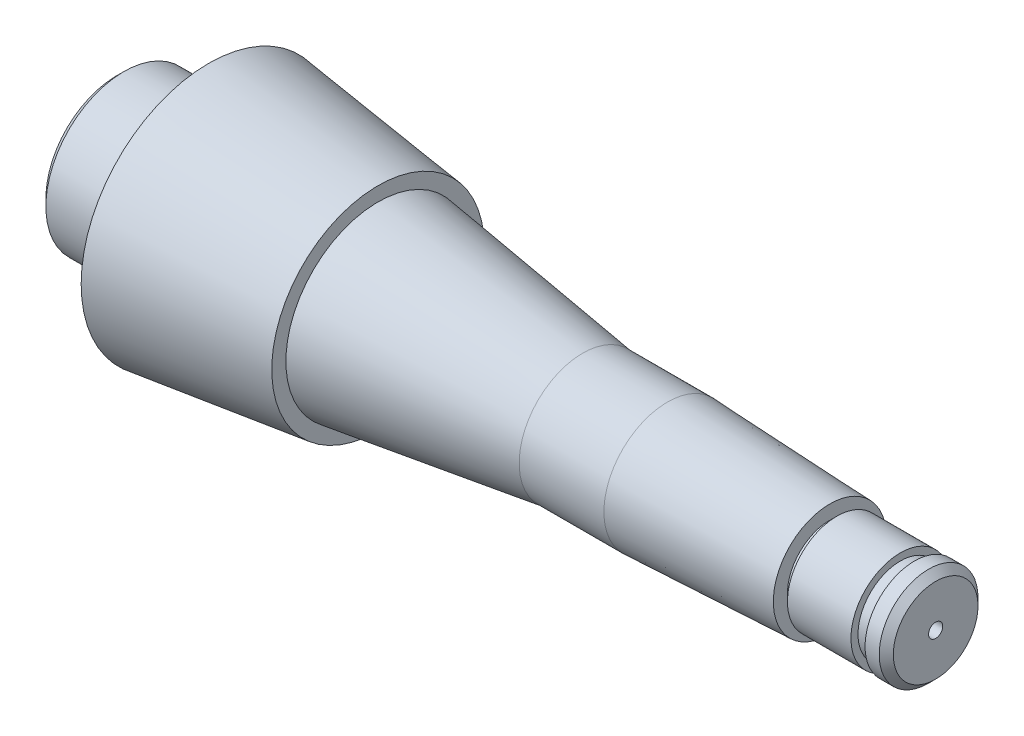
ISO-10303-21;
HEADER;
FILE_DESCRIPTION(('STEP AP214'),'2;1');
FILE_NAME('part.step','',(''),(''),'','','');
FILE_SCHEMA(('AUTOMOTIVE_DESIGN { 1 0 10303 214 1 1 1 1 }'));
ENDSEC;
DATA;
#1=APPLICATION_CONTEXT('core data for automotive mechanical design processes');
#2=APPLICATION_PROTOCOL_DEFINITION('international standard','automotive_design',2000,#1);
#3=PRODUCT_CONTEXT('',#1,'mechanical');
#4=PRODUCT('Part','Part','',(#3));
#5=PRODUCT_RELATED_PRODUCT_CATEGORY('part','',(#4));
#6=PRODUCT_DEFINITION_FORMATION('','',#4);
#7=PRODUCT_DEFINITION_CONTEXT('part definition',#1,'design');
#8=PRODUCT_DEFINITION('design','',#6,#7);
#9=PRODUCT_DEFINITION_SHAPE('','',#8);
#10=(LENGTH_UNIT() NAMED_UNIT(*) SI_UNIT(.MILLI.,.METRE.));
#11=(NAMED_UNIT(*) PLANE_ANGLE_UNIT() SI_UNIT($,.RADIAN.));
#12=(NAMED_UNIT(*) SI_UNIT($,.STERADIAN.) SOLID_ANGLE_UNIT());
#13=UNCERTAINTY_MEASURE_WITH_UNIT(LENGTH_MEASURE(1.E-05),#10,'distance_accuracy_value','');
#14=(GEOMETRIC_REPRESENTATION_CONTEXT(3) GLOBAL_UNCERTAINTY_ASSIGNED_CONTEXT((#13)) GLOBAL_UNIT_ASSIGNED_CONTEXT((#10,
#11,#12)) REPRESENTATION_CONTEXT('',''));
#15=CARTESIAN_POINT('',(0.,0.,0.));
#16=DIRECTION('',(0.,0.,1.));
#17=DIRECTION('',(1.,0.,0.));
#18=AXIS2_PLACEMENT_3D('',#15,#16,#17);
#19=CARTESIAN_POINT('',(65.,0.,0.));
#20=DIRECTION('',(-1.,0.,0.));
#21=DIRECTION('',(0.,0.,1.));
#22=AXIS2_PLACEMENT_3D('',#19,#20,#21);
#23=CONICAL_SURFACE('',#22,1.,0.463647609000803);
#24=CARTESIAN_POINT('',(66.,0.,0.));
#25=DIRECTION('',(1.,0.,0.));
#26=DIRECTION('',(0.,0.,-1.));
#27=AXIS2_PLACEMENT_3D('',#24,#25,#26);
#28=CIRCLE('',#27,0.500000000000006);
#29=CARTESIAN_POINT('',(66.,0.,-0.500000000000006));
#30=VERTEX_POINT('',#29);
#31=EDGE_CURVE('E12',#30,#30,#28,.T.);
#32=ORIENTED_EDGE('',*,*,#31,.T.);
#33=EDGE_LOOP('',(#32));
#34=FACE_BOUND('',#33,.T.);
#35=CARTESIAN_POINT('',(65.,0.,0.));
#36=DIRECTION('',(1.,0.,0.));
#37=DIRECTION('',(0.,0.,-1.));
#38=AXIS2_PLACEMENT_3D('',#35,#36,#37);
#39=CIRCLE('',#38,1.);
#40=CARTESIAN_POINT('',(65.,0.,-1.));
#41=VERTEX_POINT('',#40);
#42=EDGE_CURVE('E130',#41,#41,#39,.T.);
#43=ORIENTED_EDGE('',*,*,#42,.F.);
#44=EDGE_LOOP('',(#43));
#45=FACE_BOUND('',#44,.T.);
#46=ADVANCED_FACE('F39',(#34,#45),#23,.F.);
#47=CARTESIAN_POINT('',(15.9891729683934,0.,0.));
#48=DIRECTION('',(1.,0.,0.));
#49=DIRECTION('',(0.,0.,-1.));
#50=AXIS2_PLACEMENT_3D('',#47,#48,#49);
#51=CYLINDRICAL_SURFACE('',#50,0.500000000000007);
#52=CARTESIAN_POINT('',(78.5,0.,0.));
#53=DIRECTION('',(1.,0.,0.));
#54=DIRECTION('',(0.,0.,-1.));
#55=AXIS2_PLACEMENT_3D('',#52,#53,#54);
#56=CIRCLE('',#55,0.500000000000008);
#57=CARTESIAN_POINT('',(78.5,0.,-0.500000000000008));
#58=VERTEX_POINT('',#57);
#59=EDGE_CURVE('E45',#58,#58,#56,.T.);
#60=ORIENTED_EDGE('',*,*,#59,.T.);
#61=EDGE_LOOP('',(#60));
#62=FACE_BOUND('',#61,.T.);
#63=ORIENTED_EDGE('',*,*,#31,.F.);
#64=EDGE_LOOP('',(#63));
#65=FACE_BOUND('',#64,.T.);
#66=ADVANCED_FACE('F138',(#62,#65),#51,.F.);
#67=CARTESIAN_POINT('',(78.5,0.750000000000008,0.));
#68=DIRECTION('',(1.,0.,0.));
#69=DIRECTION('',(0.,0.,-1.));
#70=AXIS2_PLACEMENT_3D('',#67,#68,#69);
#71=PLANE('',#70);
#72=CARTESIAN_POINT('',(78.5,0.,0.));
#73=DIRECTION('',(1.,0.,0.));
#74=DIRECTION('',(0.,0.,-1.));
#75=AXIS2_PLACEMENT_3D('',#72,#73,#74);
#76=CIRCLE('',#75,0.750000000000008);
#77=CARTESIAN_POINT('',(78.5,0.,-0.750000000000008));
#78=VERTEX_POINT('',#77);
#79=EDGE_CURVE('E49',#78,#78,#76,.T.);
#80=ORIENTED_EDGE('',*,*,#79,.T.);
#81=EDGE_LOOP('',(#80));
#82=FACE_BOUND('',#81,.T.);
#83=ORIENTED_EDGE('',*,*,#59,.F.);
#84=EDGE_LOOP('',(#83));
#85=FACE_BOUND('',#84,.T.);
#86=ADVANCED_FACE('F142',(#82,#85),#71,.T.);
#87=CARTESIAN_POINT('',(15.9891729683934,0.,0.));
#88=DIRECTION('',(1.,0.,0.));
#89=DIRECTION('',(0.,0.,-1.));
#90=AXIS2_PLACEMENT_3D('',#87,#88,#89);
#91=CYLINDRICAL_SURFACE('',#90,0.750000000000008);
#92=CARTESIAN_POINT('',(79.,0.,0.));
#93=DIRECTION('',(1.,0.,0.));
#94=DIRECTION('',(0.,0.,-1.));
#95=AXIS2_PLACEMENT_3D('',#92,#93,#94);
#96=CIRCLE('',#95,0.750000000000008);
#97=CARTESIAN_POINT('',(79.,0.,-0.750000000000008));
#98=VERTEX_POINT('',#97);
#99=EDGE_CURVE('E53',#98,#98,#96,.T.);
#100=ORIENTED_EDGE('',*,*,#99,.T.);
#101=EDGE_LOOP('',(#100));
#102=FACE_BOUND('',#101,.T.);
#103=ORIENTED_EDGE('',*,*,#79,.F.);
#104=EDGE_LOOP('',(#103));
#105=FACE_BOUND('',#104,.T.);
#106=ADVANCED_FACE('F146',(#102,#105),#91,.F.);
#107=CARTESIAN_POINT('',(79.,1.,0.));
#108=DIRECTION('',(1.,0.,0.));
#109=DIRECTION('',(0.,0.,-1.));
#110=AXIS2_PLACEMENT_3D('',#107,#108,#109);
#111=PLANE('',#110);
#112=CARTESIAN_POINT('',(79.,0.,0.));
#113=DIRECTION('',(1.,0.,0.));
#114=DIRECTION('',(0.,0.,-1.));
#115=AXIS2_PLACEMENT_3D('',#112,#113,#114);
#116=CIRCLE('',#115,1.);
#117=CARTESIAN_POINT('',(79.,0.,-1.));
#118=VERTEX_POINT('',#117);
#119=EDGE_CURVE('E58',#118,#118,#116,.T.);
#120=ORIENTED_EDGE('',*,*,#119,.T.);
#121=EDGE_LOOP('',(#120));
#122=FACE_BOUND('',#121,.T.);
#123=ORIENTED_EDGE('',*,*,#99,.F.);
#124=EDGE_LOOP('',(#123));
#125=FACE_BOUND('',#124,.T.);
#126=ADVANCED_FACE('F153',(#122,#125),#111,.T.);
#127=CARTESIAN_POINT('',(15.9891729683934,0.,0.));
#128=DIRECTION('',(1.,0.,0.));
#129=DIRECTION('',(0.,0.,-1.));
#130=AXIS2_PLACEMENT_3D('',#127,#128,#129);
#131=CYLINDRICAL_SURFACE('',#130,1.00000000000001);
#132=CARTESIAN_POINT('',(116.,0.,0.));
#133=DIRECTION('',(1.,0.,0.));
#134=DIRECTION('',(0.,0.,-1.));
#135=AXIS2_PLACEMENT_3D('',#132,#133,#134);
#136=CIRCLE('',#135,1.00000000000001);
#137=CARTESIAN_POINT('',(116.,0.,-1.00000000000001));
#138=VERTEX_POINT('',#137);
#139=EDGE_CURVE('E61',#138,#138,#136,.T.);
#140=ORIENTED_EDGE('',*,*,#139,.T.);
#141=EDGE_LOOP('',(#140));
#142=FACE_BOUND('',#141,.T.);
#143=ORIENTED_EDGE('',*,*,#119,.F.);
#144=EDGE_LOOP('',(#143));
#145=FACE_BOUND('',#144,.T.);
#146=ADVANCED_FACE('F157',(#142,#145),#131,.F.);
#147=CARTESIAN_POINT('',(116.,6.00000000000001,0.));
#148=DIRECTION('',(1.,0.,0.));
#149=DIRECTION('',(0.,0.,-1.));
#150=AXIS2_PLACEMENT_3D('',#147,#148,#149);
#151=PLANE('',#150);
#152=CARTESIAN_POINT('',(116.,0.,0.));
#153=DIRECTION('',(1.,0.,0.));
#154=DIRECTION('',(0.,0.,-1.));
#155=AXIS2_PLACEMENT_3D('',#152,#153,#154);
#156=CIRCLE('',#155,6.00000000000001);
#157=CARTESIAN_POINT('',(116.,0.,-6.00000000000001));
#158=VERTEX_POINT('',#157);
#159=EDGE_CURVE('E64',#158,#158,#156,.T.);
#160=ORIENTED_EDGE('',*,*,#159,.T.);
#161=EDGE_LOOP('',(#160));
#162=FACE_BOUND('',#161,.T.);
#163=ORIENTED_EDGE('',*,*,#139,.F.);
#164=EDGE_LOOP('',(#163));
#165=FACE_BOUND('',#164,.T.);
#166=ADVANCED_FACE('F161',(#162,#165),#151,.T.);
#167=CARTESIAN_POINT('',(116.,0.,0.));
#168=DIRECTION('',(-1.,0.,0.));
#169=DIRECTION('',(0.,0.,1.));
#170=AXIS2_PLACEMENT_3D('',#167,#168,#169);
#171=CONICAL_SURFACE('',#170,6.00000000000001,0.785398163397456);
#172=CARTESIAN_POINT('',(115.,0.,0.));
#173=DIRECTION('',(1.,0.,0.));
#174=DIRECTION('',(0.,0.,-1.));
#175=AXIS2_PLACEMENT_3D('',#172,#173,#174);
#176=CIRCLE('',#175,7.00000000000003);
#177=CARTESIAN_POINT('',(115.,0.,-7.00000000000003));
#178=VERTEX_POINT('',#177);
#179=EDGE_CURVE('E67',#178,#178,#176,.T.);
#180=ORIENTED_EDGE('',*,*,#179,.T.);
#181=EDGE_LOOP('',(#180));
#182=FACE_BOUND('',#181,.T.);
#183=ORIENTED_EDGE('',*,*,#159,.F.);
#184=EDGE_LOOP('',(#183));
#185=FACE_BOUND('',#184,.T.);
#186=ADVANCED_FACE('F165',(#182,#185),#171,.T.);
#187=CARTESIAN_POINT('',(15.9891729683934,0.,0.));
#188=DIRECTION('',(1.,0.,0.));
#189=DIRECTION('',(0.,0.,-1.));
#190=AXIS2_PLACEMENT_3D('',#187,#188,#189);
#191=CYLINDRICAL_SURFACE('',#190,7.00000000000003);
#192=CARTESIAN_POINT('',(113.,0.,0.));
#193=DIRECTION('',(1.,0.,0.));
#194=DIRECTION('',(0.,0.,-1.));
#195=AXIS2_PLACEMENT_3D('',#192,#193,#194);
#196=CIRCLE('',#195,7.00000000000003);
#197=CARTESIAN_POINT('',(113.,0.,-7.00000000000003));
#198=VERTEX_POINT('',#197);
#199=EDGE_CURVE('E70',#198,#198,#196,.T.);
#200=ORIENTED_EDGE('',*,*,#199,.T.);
#201=EDGE_LOOP('',(#200));
#202=FACE_BOUND('',#201,.T.);
#203=ORIENTED_EDGE('',*,*,#179,.F.);
#204=EDGE_LOOP('',(#203));
#205=FACE_BOUND('',#204,.T.);
#206=ADVANCED_FACE('F169',(#202,#205),#191,.T.);
#207=CARTESIAN_POINT('',(113.,7.00000000000003,0.));
#208=DIRECTION('',(-1.,0.,0.));
#209=DIRECTION('',(0.,0.,1.));
#210=AXIS2_PLACEMENT_3D('',#207,#208,#209);
#211=PLANE('',#210);
#212=CARTESIAN_POINT('',(113.,0.,0.));
#213=DIRECTION('',(1.,0.,0.));
#214=DIRECTION('',(0.,0.,-1.));
#215=AXIS2_PLACEMENT_3D('',#212,#213,#214);
#216=CIRCLE('',#215,6.00000000000002);
#217=CARTESIAN_POINT('',(113.,0.,-6.00000000000002));
#218=VERTEX_POINT('',#217);
#219=EDGE_CURVE('E73',#218,#218,#216,.T.);
#220=ORIENTED_EDGE('',*,*,#219,.T.);
#221=EDGE_LOOP('',(#220));
#222=FACE_BOUND('',#221,.T.);
#223=ORIENTED_EDGE('',*,*,#199,.F.);
#224=EDGE_LOOP('',(#223));
#225=FACE_BOUND('',#224,.T.);
#226=ADVANCED_FACE('F173',(#222,#225),#211,.T.);
#227=CARTESIAN_POINT('',(15.9891729683934,0.,0.));
#228=DIRECTION('',(1.,0.,0.));
#229=DIRECTION('',(0.,0.,-1.));
#230=AXIS2_PLACEMENT_3D('',#227,#228,#229);
#231=CYLINDRICAL_SURFACE('',#230,6.00000000000002);
#232=CARTESIAN_POINT('',(111.,0.,0.));
#233=DIRECTION('',(1.,0.,0.));
#234=DIRECTION('',(0.,0.,-1.));
#235=AXIS2_PLACEMENT_3D('',#232,#233,#234);
#236=CIRCLE('',#235,6.00000000000002);
#237=CARTESIAN_POINT('',(111.,0.,-6.00000000000002));
#238=VERTEX_POINT('',#237);
#239=EDGE_CURVE('E76',#238,#238,#236,.T.);
#240=ORIENTED_EDGE('',*,*,#239,.T.);
#241=EDGE_LOOP('',(#240));
#242=FACE_BOUND('',#241,.T.);
#243=ORIENTED_EDGE('',*,*,#219,.F.);
#244=EDGE_LOOP('',(#243));
#245=FACE_BOUND('',#244,.T.);
#246=ADVANCED_FACE('F177',(#242,#245),#231,.T.);
#247=CARTESIAN_POINT('',(111.,6.00000000000003,0.));
#248=DIRECTION('',(1.,0.,0.));
#249=DIRECTION('',(0.,0.,-1.));
#250=AXIS2_PLACEMENT_3D('',#247,#248,#249);
#251=PLANE('',#250);
#252=CARTESIAN_POINT('',(111.,0.,0.));
#253=DIRECTION('',(1.,0.,0.));
#254=DIRECTION('',(0.,0.,-1.));
#255=AXIS2_PLACEMENT_3D('',#252,#253,#254);
#256=CIRCLE('',#255,7.00000000000004);
#257=CARTESIAN_POINT('',(111.,0.,-7.00000000000004));
#258=VERTEX_POINT('',#257);
#259=EDGE_CURVE('E79',#258,#258,#256,.T.);
#260=ORIENTED_EDGE('',*,*,#259,.T.);
#261=EDGE_LOOP('',(#260));
#262=FACE_BOUND('',#261,.T.);
#263=ORIENTED_EDGE('',*,*,#239,.F.);
#264=EDGE_LOOP('',(#263));
#265=FACE_BOUND('',#264,.T.);
#266=ADVANCED_FACE('F181',(#262,#265),#251,.T.);
#267=CARTESIAN_POINT('',(15.9891729683934,0.,0.));
#268=DIRECTION('',(1.,0.,0.));
#269=DIRECTION('',(0.,0.,-1.));
#270=AXIS2_PLACEMENT_3D('',#267,#268,#269);
#271=CYLINDRICAL_SURFACE('',#270,7.00000000000003);
#272=CARTESIAN_POINT('',(102.,0.,0.));
#273=DIRECTION('',(1.,0.,0.));
#274=DIRECTION('',(0.,0.,-1.));
#275=AXIS2_PLACEMENT_3D('',#272,#273,#274);
#276=CIRCLE('',#275,7.00000000000003);
#277=CARTESIAN_POINT('',(102.,0.,-7.00000000000003));
#278=VERTEX_POINT('',#277);
#279=EDGE_CURVE('E82',#278,#278,#276,.T.);
#280=ORIENTED_EDGE('',*,*,#279,.T.);
#281=EDGE_LOOP('',(#280));
#282=FACE_BOUND('',#281,.T.);
#283=ORIENTED_EDGE('',*,*,#259,.F.);
#284=EDGE_LOOP('',(#283));
#285=FACE_BOUND('',#284,.T.);
#286=ADVANCED_FACE('F185',(#282,#285),#271,.T.);
#287=CARTESIAN_POINT('',(102.,7.00000000000003,0.));
#288=DIRECTION('',(-1.,0.,0.));
#289=DIRECTION('',(0.,0.,1.));
#290=AXIS2_PLACEMENT_3D('',#287,#288,#289);
#291=PLANE('',#290);
#292=CARTESIAN_POINT('',(102.,0.,0.));
#293=DIRECTION('',(1.,0.,0.));
#294=DIRECTION('',(0.,0.,-1.));
#295=AXIS2_PLACEMENT_3D('',#292,#293,#294);
#296=CIRCLE('',#295,6.00000000000002);
#297=CARTESIAN_POINT('',(102.,0.,-6.00000000000002));
#298=VERTEX_POINT('',#297);
#299=EDGE_CURVE('E85',#298,#298,#296,.T.);
#300=ORIENTED_EDGE('',*,*,#299,.T.);
#301=EDGE_LOOP('',(#300));
#302=FACE_BOUND('',#301,.T.);
#303=ORIENTED_EDGE('',*,*,#279,.F.);
#304=EDGE_LOOP('',(#303));
#305=FACE_BOUND('',#304,.T.);
#306=ADVANCED_FACE('F189',(#302,#305),#291,.T.);
#307=CARTESIAN_POINT('',(15.9891729683934,0.,0.));
#308=DIRECTION('',(1.,0.,0.));
#309=DIRECTION('',(0.,0.,-1.));
#310=AXIS2_PLACEMENT_3D('',#307,#308,#309);
#311=CYLINDRICAL_SURFACE('',#310,6.00000000000002);
#312=CARTESIAN_POINT('',(101.,0.,0.));
#313=DIRECTION('',(1.,0.,0.));
#314=DIRECTION('',(0.,0.,-1.));
#315=AXIS2_PLACEMENT_3D('',#312,#313,#314);
#316=CIRCLE('',#315,6.00000000000002);
#317=CARTESIAN_POINT('',(101.,0.,-6.00000000000002));
#318=VERTEX_POINT('',#317);
#319=EDGE_CURVE('E88',#318,#318,#316,.T.);
#320=ORIENTED_EDGE('',*,*,#319,.T.);
#321=EDGE_LOOP('',(#320));
#322=FACE_BOUND('',#321,.T.);
#323=ORIENTED_EDGE('',*,*,#299,.F.);
#324=EDGE_LOOP('',(#323));
#325=FACE_BOUND('',#324,.T.);
#326=ADVANCED_FACE('F193',(#322,#325),#311,.T.);
#327=CARTESIAN_POINT('',(101.,6.00000000000003,0.));
#328=DIRECTION('',(1.,0.,0.));
#329=DIRECTION('',(0.,0.,-1.));
#330=AXIS2_PLACEMENT_3D('',#327,#328,#329);
#331=PLANE('',#330);
#332=CARTESIAN_POINT('',(101.,0.,0.));
#333=DIRECTION('',(1.,0.,0.));
#334=DIRECTION('',(0.,0.,-1.));
#335=AXIS2_PLACEMENT_3D('',#332,#333,#334);
#336=CIRCLE('',#335,8.00000000000002);
#337=CARTESIAN_POINT('',(101.,0.,-8.00000000000002));
#338=VERTEX_POINT('',#337);
#339=EDGE_CURVE('E91',#338,#338,#336,.T.);
#340=ORIENTED_EDGE('',*,*,#339,.T.);
#341=EDGE_LOOP('',(#340));
#342=FACE_BOUND('',#341,.T.);
#343=ORIENTED_EDGE('',*,*,#319,.F.);
#344=EDGE_LOOP('',(#343));
#345=FACE_BOUND('',#344,.T.);
#346=ADVANCED_FACE('F197',(#342,#345),#331,.T.);
#347=CARTESIAN_POINT('',(101.,0.,0.));
#348=DIRECTION('',(-1.,0.,0.));
#349=DIRECTION('',(0.,0.,1.));
#350=AXIS2_PLACEMENT_3D('',#347,#348,#349);
#351=CONICAL_SURFACE('',#350,8.00000000000002,0.0434508953915303);
#352=CARTESIAN_POINT('',(78.,0.,0.));
#353=DIRECTION('',(1.,0.,0.));
#354=DIRECTION('',(0.,0.,-1.));
#355=AXIS2_PLACEMENT_3D('',#352,#353,#354);
#356=CIRCLE('',#355,9.00000000000001);
#357=CARTESIAN_POINT('',(78.,0.,-9.00000000000001));
#358=VERTEX_POINT('',#357);
#359=EDGE_CURVE('E94',#358,#358,#356,.T.);
#360=ORIENTED_EDGE('',*,*,#359,.T.);
#361=EDGE_LOOP('',(#360));
#362=FACE_BOUND('',#361,.T.);
#363=ORIENTED_EDGE('',*,*,#339,.F.);
#364=EDGE_LOOP('',(#363));
#365=FACE_BOUND('',#364,.T.);
#366=ADVANCED_FACE('F201',(#362,#365),#351,.T.);
#367=CARTESIAN_POINT('',(15.9891729683934,0.,0.));
#368=DIRECTION('',(1.,0.,0.));
#369=DIRECTION('',(0.,0.,-1.));
#370=AXIS2_PLACEMENT_3D('',#367,#368,#369);
#371=CYLINDRICAL_SURFACE('',#370,9.00000000000001);
#372=CARTESIAN_POINT('',(66.,0.,0.));
#373=DIRECTION('',(1.,0.,0.));
#374=DIRECTION('',(0.,0.,-1.));
#375=AXIS2_PLACEMENT_3D('',#372,#373,#374);
#376=CIRCLE('',#375,9.00000000000001);
#377=CARTESIAN_POINT('',(66.,0.,-9.00000000000001));
#378=VERTEX_POINT('',#377);
#379=EDGE_CURVE('E97',#378,#378,#376,.T.);
#380=ORIENTED_EDGE('',*,*,#379,.T.);
#381=EDGE_LOOP('',(#380));
#382=FACE_BOUND('',#381,.T.);
#383=ORIENTED_EDGE('',*,*,#359,.F.);
#384=EDGE_LOOP('',(#383));
#385=FACE_BOUND('',#384,.T.);
#386=ADVANCED_FACE('F205',(#382,#385),#371,.T.);
#387=CARTESIAN_POINT('',(66.,0.,0.));
#388=DIRECTION('',(-1.,0.,0.));
#389=DIRECTION('',(0.,0.,1.));
#390=AXIS2_PLACEMENT_3D('',#387,#388,#389);
#391=CONICAL_SURFACE('',#390,9.00000000000001,0.138944443982087);
#392=CARTESIAN_POINT('',(37.,0.,0.));
#393=DIRECTION('',(1.,0.,0.));
#394=DIRECTION('',(0.,0.,-1.));
#395=AXIS2_PLACEMENT_3D('',#392,#393,#394);
#396=CIRCLE('',#395,13.0555205562947);
#397=CARTESIAN_POINT('',(37.,0.,-13.0555205562947));
#398=VERTEX_POINT('',#397);
#399=EDGE_CURVE('E100',#398,#398,#396,.T.);
#400=ORIENTED_EDGE('',*,*,#399,.T.);
#401=EDGE_LOOP('',(#400));
#402=FACE_BOUND('',#401,.T.);
#403=ORIENTED_EDGE('',*,*,#379,.F.);
#404=EDGE_LOOP('',(#403));
#405=FACE_BOUND('',#404,.T.);
#406=ADVANCED_FACE('F209',(#402,#405),#391,.T.);
#407=CARTESIAN_POINT('',(37.,15.0555205562947,0.));
#408=DIRECTION('',(1.,0.,0.));
#409=DIRECTION('',(0.,0.,-1.));
#410=AXIS2_PLACEMENT_3D('',#407,#408,#409);
#411=PLANE('',#410);
#412=CARTESIAN_POINT('',(37.,0.,0.));
#413=DIRECTION('',(1.,0.,0.));
#414=DIRECTION('',(0.,0.,-1.));
#415=AXIS2_PLACEMENT_3D('',#412,#413,#414);
#416=CIRCLE('',#415,15.0555205562947);
#417=CARTESIAN_POINT('',(37.,0.,-15.0555205562947));
#418=VERTEX_POINT('',#417);
#419=EDGE_CURVE('E103',#418,#418,#416,.T.);
#420=ORIENTED_EDGE('',*,*,#419,.T.);
#421=EDGE_LOOP('',(#420));
#422=FACE_BOUND('',#421,.T.);
#423=ORIENTED_EDGE('',*,*,#399,.F.);
#424=EDGE_LOOP('',(#423));
#425=FACE_BOUND('',#424,.T.);
#426=ADVANCED_FACE('F213',(#422,#425),#411,.T.);
#427=CARTESIAN_POINT('',(37.,0.,0.));
#428=DIRECTION('',(-1.,0.,0.));
#429=DIRECTION('',(0.,0.,1.));
#430=AXIS2_PLACEMENT_3D('',#427,#428,#429);
#431=CONICAL_SURFACE('',#430,15.0555205562947,0.124354994546762);
#432=CARTESIAN_POINT('',(13.,0.,0.));
#433=DIRECTION('',(1.,0.,0.));
#434=DIRECTION('',(0.,0.,-1.));
#435=AXIS2_PLACEMENT_3D('',#432,#433,#434);
#436=CIRCLE('',#435,18.0555205562947);
#437=CARTESIAN_POINT('',(13.,0.,-18.0555205562947));
#438=VERTEX_POINT('',#437);
#439=EDGE_CURVE('E106',#438,#438,#436,.T.);
#440=ORIENTED_EDGE('',*,*,#439,.T.);
#441=EDGE_LOOP('',(#440));
#442=FACE_BOUND('',#441,.T.);
#443=ORIENTED_EDGE('',*,*,#419,.F.);
#444=EDGE_LOOP('',(#443));
#445=FACE_BOUND('',#444,.T.);
#446=ADVANCED_FACE('F217',(#442,#445),#431,.T.);
#447=CARTESIAN_POINT('',(13.,11.0555205562947,0.));
#448=DIRECTION('',(-1.,0.,0.));
#449=DIRECTION('',(0.,0.,1.));
#450=AXIS2_PLACEMENT_3D('',#447,#448,#449);
#451=PLANE('',#450);
#452=CARTESIAN_POINT('',(13.,0.,0.));
#453=DIRECTION('',(1.,0.,0.));
#454=DIRECTION('',(0.,0.,-1.));
#455=AXIS2_PLACEMENT_3D('',#452,#453,#454);
#456=CIRCLE('',#455,11.0555205562947);
#457=CARTESIAN_POINT('',(13.,0.,-11.0555205562947));
#458=VERTEX_POINT('',#457);
#459=EDGE_CURVE('E109',#458,#458,#456,.T.);
#460=ORIENTED_EDGE('',*,*,#459,.T.);
#461=EDGE_LOOP('',(#460));
#462=FACE_BOUND('',#461,.T.);
#463=ORIENTED_EDGE('',*,*,#439,.F.);
#464=EDGE_LOOP('',(#463));
#465=FACE_BOUND('',#464,.T.);
#466=ADVANCED_FACE('F221',(#462,#465),#451,.T.);
#467=CARTESIAN_POINT('',(15.9891729683934,0.,0.));
#468=DIRECTION('',(1.,0.,0.));
#469=DIRECTION('',(0.,0.,-1.));
#470=AXIS2_PLACEMENT_3D('',#467,#468,#469);
#471=CYLINDRICAL_SURFACE('',#470,11.0555205562947);
#472=CARTESIAN_POINT('',(1.,0.,0.));
#473=DIRECTION('',(1.,0.,0.));
#474=DIRECTION('',(0.,0.,-1.));
#475=AXIS2_PLACEMENT_3D('',#472,#473,#474);
#476=CIRCLE('',#475,11.0555205562947);
#477=CARTESIAN_POINT('',(1.,0.,-11.0555205562947));
#478=VERTEX_POINT('',#477);
#479=EDGE_CURVE('E112',#478,#478,#476,.T.);
#480=ORIENTED_EDGE('',*,*,#479,.T.);
#481=EDGE_LOOP('',(#480));
#482=FACE_BOUND('',#481,.T.);
#483=ORIENTED_EDGE('',*,*,#459,.F.);
#484=EDGE_LOOP('',(#483));
#485=FACE_BOUND('',#484,.T.);
#486=ADVANCED_FACE('F225',(#482,#485),#471,.T.);
#487=CARTESIAN_POINT('',(1.,0.,0.));
#488=DIRECTION('',(1.,0.,0.));
#489=DIRECTION('',(0.,0.,-1.));
#490=AXIS2_PLACEMENT_3D('',#487,#488,#489);
#491=CONICAL_SURFACE('',#490,11.0555205562947,0.785398163397419);
#492=CARTESIAN_POINT('',(0.,0.,0.));
#493=DIRECTION('',(1.,0.,0.));
#494=DIRECTION('',(0.,0.,-1.));
#495=AXIS2_PLACEMENT_3D('',#492,#493,#494);
#496=CIRCLE('',#495,10.0555205562947);
#497=CARTESIAN_POINT('',(0.,0.,-10.0555205562947));
#498=VERTEX_POINT('',#497);
#499=EDGE_CURVE('E115',#498,#498,#496,.T.);
#500=ORIENTED_EDGE('',*,*,#499,.T.);
#501=EDGE_LOOP('',(#500));
#502=FACE_BOUND('',#501,.T.);
#503=ORIENTED_EDGE('',*,*,#479,.F.);
#504=EDGE_LOOP('',(#503));
#505=FACE_BOUND('',#504,.T.);
#506=ADVANCED_FACE('F229',(#502,#505),#491,.T.);
#507=CARTESIAN_POINT('',(0.,8.05552055629471,0.));
#508=DIRECTION('',(-1.,0.,0.));
#509=DIRECTION('',(0.,0.,1.));
#510=AXIS2_PLACEMENT_3D('',#507,#508,#509);
#511=PLANE('',#510);
#512=CARTESIAN_POINT('',(0.,0.,0.));
#513=DIRECTION('',(1.,0.,0.));
#514=DIRECTION('',(0.,0.,-1.));
#515=AXIS2_PLACEMENT_3D('',#512,#513,#514);
#516=CIRCLE('',#515,8.05552055629471);
#517=CARTESIAN_POINT('',(0.,0.,-8.05552055629471));
#518=VERTEX_POINT('',#517);
#519=EDGE_CURVE('E118',#518,#518,#516,.T.);
#520=ORIENTED_EDGE('',*,*,#519,.T.);
#521=EDGE_LOOP('',(#520));
#522=FACE_BOUND('',#521,.T.);
#523=ORIENTED_EDGE('',*,*,#499,.F.);
#524=EDGE_LOOP('',(#523));
#525=FACE_BOUND('',#524,.T.);
#526=ADVANCED_FACE('F233',(#522,#525),#511,.T.);
#527=CARTESIAN_POINT('',(0.,0.,0.));
#528=DIRECTION('',(-1.,0.,0.));
#529=DIRECTION('',(0.,0.,1.));
#530=AXIS2_PLACEMENT_3D('',#527,#528,#529);
#531=CONICAL_SURFACE('',#530,8.05552055629471,0.174532925199433);
#532=CARTESIAN_POINT('',(23.,0.,0.));
#533=DIRECTION('',(1.,0.,0.));
#534=DIRECTION('',(0.,0.,-1.));
#535=AXIS2_PLACEMENT_3D('',#532,#533,#534);
#536=CIRCLE('',#535,4.);
#537=CARTESIAN_POINT('',(23.,0.,-4.));
#538=VERTEX_POINT('',#537);
#539=EDGE_CURVE('E121',#538,#538,#536,.T.);
#540=ORIENTED_EDGE('',*,*,#539,.T.);
#541=EDGE_LOOP('',(#540));
#542=FACE_BOUND('',#541,.T.);
#543=ORIENTED_EDGE('',*,*,#519,.F.);
#544=EDGE_LOOP('',(#543));
#545=FACE_BOUND('',#544,.T.);
#546=ADVANCED_FACE('F237',(#542,#545),#531,.F.);
#547=CARTESIAN_POINT('',(15.9891729683934,0.,0.));
#548=DIRECTION('',(1.,0.,0.));
#549=DIRECTION('',(0.,0.,-1.));
#550=AXIS2_PLACEMENT_3D('',#547,#548,#549);
#551=CYLINDRICAL_SURFACE('',#550,4.00000000000001);
#552=CARTESIAN_POINT('',(33.,0.,0.));
#553=DIRECTION('',(1.,0.,0.));
#554=DIRECTION('',(0.,0.,-1.));
#555=AXIS2_PLACEMENT_3D('',#552,#553,#554);
#556=CIRCLE('',#555,4.00000000000001);
#557=CARTESIAN_POINT('',(33.,0.,4.00000000000001));
#558=VERTEX_POINT('',#557);
#559=EDGE_CURVE('E124',#558,#558,#556,.T.);
#560=ORIENTED_EDGE('',*,*,#559,.T.);
#561=EDGE_LOOP('',(#560));
#562=FACE_BOUND('',#561,.T.);
#563=ORIENTED_EDGE('',*,*,#539,.F.);
#564=EDGE_LOOP('',(#563));
#565=FACE_BOUND('',#564,.T.);
#566=ADVANCED_FACE('F241',(#562,#565),#551,.F.);
#567=CARTESIAN_POINT('',(33.,0.,0.));
#568=DIRECTION('',(-1.,0.,0.));
#569=DIRECTION('',(0.,0.,1.));
#570=AXIS2_PLACEMENT_3D('',#567,#568,#569);
#571=CONICAL_SURFACE('',#570,4.00000000000001,0.785398163397449);
#572=CARTESIAN_POINT('',(36.,0.,0.));
#573=DIRECTION('',(1.,0.,0.));
#574=DIRECTION('',(0.,0.,-1.));
#575=AXIS2_PLACEMENT_3D('',#572,#573,#574);
#576=CIRCLE('',#575,1.);
#577=CARTESIAN_POINT('',(36.,0.,1.00000000000001));
#578=VERTEX_POINT('',#577);
#579=EDGE_CURVE('E127',#578,#578,#576,.T.);
#580=CARTESIAN_POINT('',(36.,0.,1.00000000000001));
#581=CARTESIAN_POINT('',(35.96875,0.,1.03125000000001));
#582=CARTESIAN_POINT('',(35.9375,0.,1.06250000000001));
#583=CARTESIAN_POINT('',(35.875,0.,1.12500000000001));
#584=CARTESIAN_POINT('',(35.84375,0.,1.15625000000001));
#585=CARTESIAN_POINT('',(35.78125,0.,1.21875000000001));
#586=CARTESIAN_POINT('',(35.75,0.,1.25000000000001));
#587=CARTESIAN_POINT('',(35.6875,0.,1.31250000000001));
#588=CARTESIAN_POINT('',(35.65625,0.,1.34375000000001));
#589=CARTESIAN_POINT('',(35.59375,0.,1.40625000000001));
#590=CARTESIAN_POINT('',(35.5625,0.,1.43750000000001));
#591=CARTESIAN_POINT('',(35.5,0.,1.50000000000001));
#592=CARTESIAN_POINT('',(35.46875,0.,1.53125000000001));
#593=CARTESIAN_POINT('',(35.40625,0.,1.59375000000001));
#594=CARTESIAN_POINT('',(35.375,0.,1.62500000000001));
#595=CARTESIAN_POINT('',(35.3125,0.,1.68750000000001));
#596=CARTESIAN_POINT('',(35.28125,0.,1.71875000000001));
#597=CARTESIAN_POINT('',(35.21875,0.,1.78125000000001));
#598=CARTESIAN_POINT('',(35.1875,0.,1.81250000000001));
#599=CARTESIAN_POINT('',(35.125,0.,1.87500000000001));
#600=CARTESIAN_POINT('',(35.09375,0.,1.90625000000001));
#601=CARTESIAN_POINT('',(35.03125,0.,1.96875000000001));
#602=CARTESIAN_POINT('',(35.,0.,2.00000000000001));
#603=CARTESIAN_POINT('',(34.9375,0.,2.06250000000001));
#604=CARTESIAN_POINT('',(34.90625,0.,2.09375000000001));
#605=CARTESIAN_POINT('',(34.84375,0.,2.15625000000001));
#606=CARTESIAN_POINT('',(34.8125,0.,2.18750000000001));
#607=CARTESIAN_POINT('',(34.75,0.,2.25000000000001));
#608=CARTESIAN_POINT('',(34.71875,0.,2.28125000000001));
#609=CARTESIAN_POINT('',(34.65625,0.,2.34375000000001));
#610=CARTESIAN_POINT('',(34.625,0.,2.37500000000001));
#611=CARTESIAN_POINT('',(34.5625,0.,2.43750000000001));
#612=CARTESIAN_POINT('',(34.53125,0.,2.46875000000001));
#613=CARTESIAN_POINT('',(34.46875,0.,2.53125000000001));
#614=CARTESIAN_POINT('',(34.4375,0.,2.56250000000001));
#615=CARTESIAN_POINT('',(34.375,0.,2.62500000000001));
#616=CARTESIAN_POINT('',(34.34375,0.,2.65625000000001));
#617=CARTESIAN_POINT('',(34.28125,0.,2.71875000000001));
#618=CARTESIAN_POINT('',(34.25,0.,2.75000000000001));
#619=CARTESIAN_POINT('',(34.1875,0.,2.81250000000001));
#620=CARTESIAN_POINT('',(34.15625,0.,2.84375000000001));
#621=CARTESIAN_POINT('',(34.09375,0.,2.90625000000001));
#622=CARTESIAN_POINT('',(34.0625,0.,2.93750000000001));
#623=CARTESIAN_POINT('',(34.,0.,3.00000000000001));
#624=CARTESIAN_POINT('',(33.96875,0.,3.03125000000001));
#625=CARTESIAN_POINT('',(33.90625,0.,3.09375000000001));
#626=CARTESIAN_POINT('',(33.875,0.,3.12500000000001));
#627=CARTESIAN_POINT('',(33.8125,0.,3.18750000000001));
#628=CARTESIAN_POINT('',(33.78125,0.,3.21875000000001));
#629=CARTESIAN_POINT('',(33.71875,0.,3.28125000000001));
#630=CARTESIAN_POINT('',(33.6875,0.,3.31250000000001));
#631=CARTESIAN_POINT('',(33.625,0.,3.37500000000001));
#632=CARTESIAN_POINT('',(33.59375,0.,3.40625000000001));
#633=CARTESIAN_POINT('',(33.53125,0.,3.46875000000001));
#634=CARTESIAN_POINT('',(33.5,0.,3.50000000000001));
#635=CARTESIAN_POINT('',(33.4375,0.,3.56250000000001));
#636=CARTESIAN_POINT('',(33.40625,0.,3.59375000000001));
#637=CARTESIAN_POINT('',(33.34375,0.,3.65625000000001));
#638=CARTESIAN_POINT('',(33.3125,0.,3.68750000000001));
#639=CARTESIAN_POINT('',(33.25,0.,3.75000000000001));
#640=CARTESIAN_POINT('',(33.21875,0.,3.78125000000001));
#641=CARTESIAN_POINT('',(33.15625,0.,3.84375000000001));
#642=CARTESIAN_POINT('',(33.125,0.,3.87500000000001));
#643=CARTESIAN_POINT('',(33.0625,0.,3.93750000000001));
#644=CARTESIAN_POINT('',(33.03125,0.,3.96875000000001));
#645=CARTESIAN_POINT('',(33.,0.,4.00000000000001));
#646=B_SPLINE_CURVE_WITH_KNOTS('',3,(#580,#581,#582,#583,#584,#585,#586,#587,#588,#589,#590,
#591,#592,#593,#594,#595,#596,#597,#598,#599,#600,#601,#602,#603,#604,#605,#606,#607,#608,#609,
#610,#611,#612,#613,#614,#615,#616,#617,#618,#619,#620,#621,#622,#623,#624,#625,#626,#627,#628,
#629,#630,#631,#632,#633,#634,#635,#636,#637,#638,#639,#640,#641,#642,#643,#644,#645),
.UNSPECIFIED.,.F.,.F.,(4,2,2,2,2,2,2,2,2,2,2,2,2,2,2,2,2,2,2,2,2,2,2,2,2,2,2,2,2,2,2,2,4),(0.,
0.13258252147248,0.26516504294496,0.397747564417436,0.530330085889911,0.662912607362391,
0.795495128834872,0.928077650307347,1.06066017177982,1.1932426932523,1.32582521472478,
1.45840773619726,1.59099025766973,1.72357277914221,1.85615530061469,1.98873782208717,
2.12132034355964,2.25390286503212,2.38648538650461,2.51906790797708,2.65165042944956,
2.78423295092204,2.91681547239452,3.04939799386699,3.18198051533947,3.31456303681195,
3.44714555828443,3.5797280797569,3.71231060122938,3.84489312270186,3.97747564417434,
4.11005816564682,4.24264068711929),.UNSPECIFIED.);
#647=EDGE_CURVE('BSEAM245',#578,#558,#646,.T.);
#648=ORIENTED_EDGE('',*,*,#579,.T.);
#649=ORIENTED_EDGE('',*,*,#559,.F.);
#650=ORIENTED_EDGE('',*,*,#647,.T.);
#651=ORIENTED_EDGE('',*,*,#647,.F.);
#652=EDGE_LOOP('',(#648,#650,#649,#651));
#653=FACE_BOUND('',#652,.T.);
#654=ADVANCED_FACE('F245',(#653),#571,.F.);
#655=CARTESIAN_POINT('',(15.9891729683934,0.,0.));
#656=DIRECTION('',(1.,0.,0.));
#657=DIRECTION('',(0.,0.,-1.));
#658=AXIS2_PLACEMENT_3D('',#655,#656,#657);
#659=CYLINDRICAL_SURFACE('',#658,1.);
#660=ORIENTED_EDGE('',*,*,#42,.T.);
#661=EDGE_LOOP('',(#660));
#662=FACE_BOUND('',#661,.T.);
#663=ORIENTED_EDGE('',*,*,#579,.F.);
#664=EDGE_LOOP('',(#663));
#665=FACE_BOUND('',#664,.T.);
#666=ADVANCED_FACE('F134',(#662,#665),#659,.F.);
#667=CLOSED_SHELL('',(#46,#66,#86,#106,#126,#146,#166,#186,#206,#226,#246,#266,#286,#306,#326,
#346,#366,#386,#406,#426,#446,#466,#486,#506,#526,#546,#566,#654,#666));
#668=MANIFOLD_SOLID_BREP('B2',#667);
#669=ADVANCED_BREP_SHAPE_REPRESENTATION('',(#18,#668),#14);
#670=SHAPE_DEFINITION_REPRESENTATION(#9,#669);
ENDSEC;
END-ISO-10303-21;
